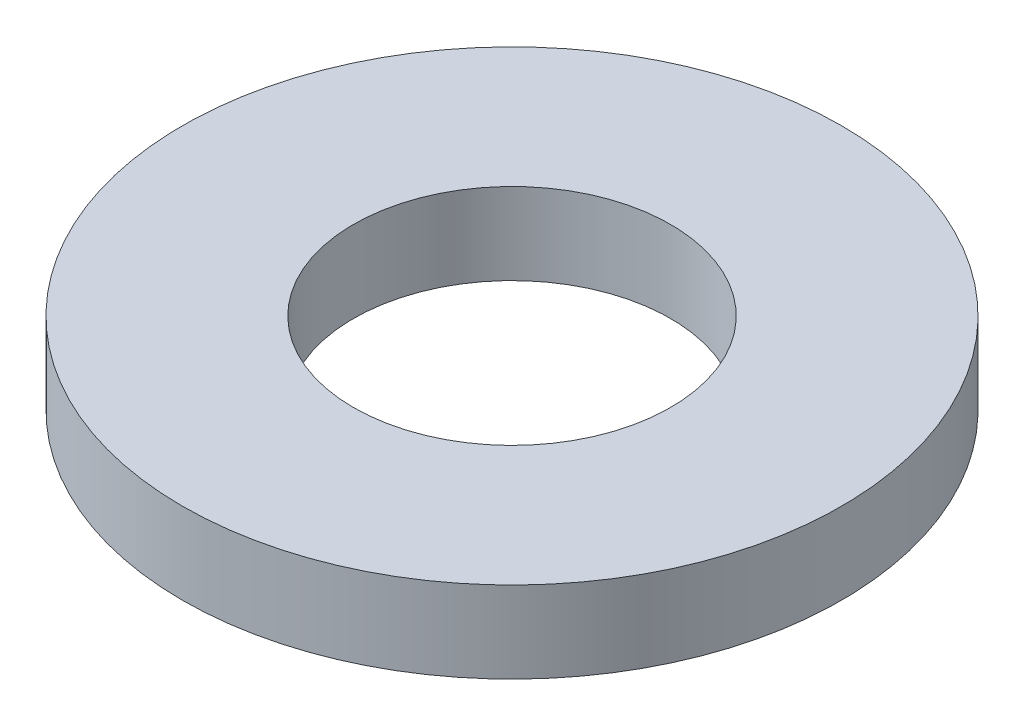
ISO-10303-21;
HEADER;
FILE_DESCRIPTION(('STEP AP214'),'2;1');
FILE_NAME('part.step','',(''),(''),'','','');
FILE_SCHEMA(('AUTOMOTIVE_DESIGN { 1 0 10303 214 1 1 1 1 }'));
ENDSEC;
DATA;
#1=APPLICATION_CONTEXT('core data for automotive mechanical design processes');
#2=APPLICATION_PROTOCOL_DEFINITION('international standard','automotive_design',2000,#1);
#3=PRODUCT_CONTEXT('',#1,'mechanical');
#4=PRODUCT('Part','Part','',(#3));
#5=PRODUCT_RELATED_PRODUCT_CATEGORY('part','',(#4));
#6=PRODUCT_DEFINITION_FORMATION('','',#4);
#7=PRODUCT_DEFINITION_CONTEXT('part definition',#1,'design');
#8=PRODUCT_DEFINITION('design','',#6,#7);
#9=PRODUCT_DEFINITION_SHAPE('','',#8);
#10=(LENGTH_UNIT() NAMED_UNIT(*) SI_UNIT(.MILLI.,.METRE.));
#11=(NAMED_UNIT(*) PLANE_ANGLE_UNIT() SI_UNIT($,.RADIAN.));
#12=(NAMED_UNIT(*) SI_UNIT($,.STERADIAN.) SOLID_ANGLE_UNIT());
#13=UNCERTAINTY_MEASURE_WITH_UNIT(LENGTH_MEASURE(1.E-05),#10,'distance_accuracy_value','');
#14=(GEOMETRIC_REPRESENTATION_CONTEXT(3) GLOBAL_UNCERTAINTY_ASSIGNED_CONTEXT((#13)) GLOBAL_UNIT_ASSIGNED_CONTEXT((#10,
#11,#12)) REPRESENTATION_CONTEXT('',''));
#15=CARTESIAN_POINT('',(0.,0.,0.));
#16=DIRECTION('',(0.,0.,1.));
#17=DIRECTION('',(1.,0.,0.));
#18=AXIS2_PLACEMENT_3D('',#15,#16,#17);
#19=CARTESIAN_POINT('',(0.,23.,0.));
#20=DIRECTION('',(0.,1.,0.));
#21=DIRECTION('',(0.,0.,1.));
#22=AXIS2_PLACEMENT_3D('',#19,#20,#21);
#23=PLANE('',#22);
#24=CARTESIAN_POINT('',(0.,23.,0.));
#25=DIRECTION('',(0.,1.,0.));
#26=DIRECTION('',(0.,0.,1.));
#27=AXIS2_PLACEMENT_3D('',#24,#25,#26);
#28=CIRCLE('',#27,93.);
#29=CARTESIAN_POINT('',(0.,23.,93.));
#30=VERTEX_POINT('',#29);
#31=EDGE_CURVE('E10',#30,#30,#28,.T.);
#32=ORIENTED_EDGE('',*,*,#31,.T.);
#33=EDGE_LOOP('',(#32));
#34=FACE_BOUND('',#33,.T.);
#35=CARTESIAN_POINT('',(0.,23.,0.));
#36=DIRECTION('',(0.,1.,0.));
#37=DIRECTION('',(0.,0.,1.));
#38=AXIS2_PLACEMENT_3D('',#35,#36,#37);
#39=CIRCLE('',#38,44.75);
#40=CARTESIAN_POINT('',(0.,23.,44.75));
#41=VERTEX_POINT('',#40);
#42=EDGE_CURVE('E44',#41,#41,#39,.T.);
#43=ORIENTED_EDGE('',*,*,#42,.F.);
#44=EDGE_LOOP('',(#43));
#45=FACE_BOUND('',#44,.T.);
#46=ADVANCED_FACE('F33',(#34,#45),#23,.T.);
#47=CARTESIAN_POINT('',(0.,0.,0.));
#48=DIRECTION('',(0.,1.,0.));
#49=DIRECTION('',(0.,0.,1.));
#50=AXIS2_PLACEMENT_3D('',#47,#48,#49);
#51=PLANE('',#50);
#52=CARTESIAN_POINT('',(0.,0.,0.));
#53=DIRECTION('',(0.,1.,0.));
#54=DIRECTION('',(0.,0.,1.));
#55=AXIS2_PLACEMENT_3D('',#52,#53,#54);
#56=CIRCLE('',#55,93.);
#57=CARTESIAN_POINT('',(0.,0.,93.));
#58=VERTEX_POINT('',#57);
#59=EDGE_CURVE('E37',#58,#58,#56,.T.);
#60=ORIENTED_EDGE('',*,*,#59,.F.);
#61=EDGE_LOOP('',(#60));
#62=FACE_BOUND('',#61,.T.);
#63=CARTESIAN_POINT('',(0.,0.,0.));
#64=DIRECTION('',(0.,1.,0.));
#65=DIRECTION('',(0.,0.,1.));
#66=AXIS2_PLACEMENT_3D('',#63,#64,#65);
#67=CIRCLE('',#66,44.75);
#68=CARTESIAN_POINT('',(0.,0.,44.75));
#69=VERTEX_POINT('',#68);
#70=EDGE_CURVE('E46',#69,#69,#67,.T.);
#71=ORIENTED_EDGE('',*,*,#70,.T.);
#72=EDGE_LOOP('',(#71));
#73=FACE_BOUND('',#72,.T.);
#74=ADVANCED_FACE('F56',(#62,#73),#51,.F.);
#75=CARTESIAN_POINT('',(0.,23.,0.));
#76=DIRECTION('',(0.,-1.,0.));
#77=DIRECTION('',(0.,0.,-1.));
#78=AXIS2_PLACEMENT_3D('',#75,#76,#77);
#79=CYLINDRICAL_SURFACE('',#78,93.);
#80=ORIENTED_EDGE('',*,*,#31,.F.);
#81=EDGE_LOOP('',(#80));
#82=FACE_BOUND('',#81,.T.);
#83=ORIENTED_EDGE('',*,*,#59,.T.);
#84=EDGE_LOOP('',(#83));
#85=FACE_BOUND('',#84,.T.);
#86=ADVANCED_FACE('F35',(#82,#85),#79,.T.);
#87=CARTESIAN_POINT('',(0.,23.,0.));
#88=DIRECTION('',(0.,-1.,0.));
#89=DIRECTION('',(0.,0.,-1.));
#90=AXIS2_PLACEMENT_3D('',#87,#88,#89);
#91=CYLINDRICAL_SURFACE('',#90,44.75);
#92=ORIENTED_EDGE('',*,*,#42,.T.);
#93=EDGE_LOOP('',(#92));
#94=FACE_BOUND('',#93,.T.);
#95=ORIENTED_EDGE('',*,*,#70,.F.);
#96=EDGE_LOOP('',(#95));
#97=FACE_BOUND('',#96,.T.);
#98=ADVANCED_FACE('F52',(#94,#97),#91,.F.);
#99=CLOSED_SHELL('',(#46,#74,#86,#98));
#100=MANIFOLD_SOLID_BREP('B2',#99);
#101=ADVANCED_BREP_SHAPE_REPRESENTATION('',(#18,#100),#14);
#102=SHAPE_DEFINITION_REPRESENTATION(#9,#101);
ENDSEC;
END-ISO-10303-21;
